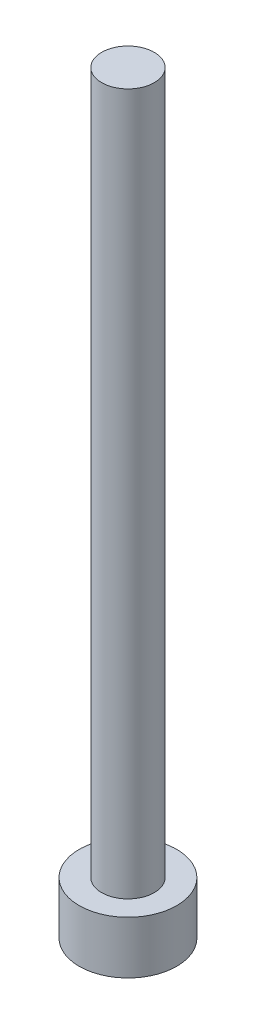
ISO-10303-21;
HEADER;
FILE_DESCRIPTION(('STEP AP214'),'2;1');
FILE_NAME('part.step','',(''),(''),'','','');
FILE_SCHEMA(('AUTOMOTIVE_DESIGN { 1 0 10303 214 1 1 1 1 }'));
ENDSEC;
DATA;
#1=APPLICATION_CONTEXT('core data for automotive mechanical design processes');
#2=APPLICATION_PROTOCOL_DEFINITION('international standard','automotive_design',2000,#1);
#3=PRODUCT_CONTEXT('',#1,'mechanical');
#4=PRODUCT('Part','Part','',(#3));
#5=PRODUCT_RELATED_PRODUCT_CATEGORY('part','',(#4));
#6=PRODUCT_DEFINITION_FORMATION('','',#4);
#7=PRODUCT_DEFINITION_CONTEXT('part definition',#1,'design');
#8=PRODUCT_DEFINITION('design','',#6,#7);
#9=PRODUCT_DEFINITION_SHAPE('','',#8);
#10=(LENGTH_UNIT() NAMED_UNIT(*) SI_UNIT(.MILLI.,.METRE.));
#11=(NAMED_UNIT(*) PLANE_ANGLE_UNIT() SI_UNIT($,.RADIAN.));
#12=(NAMED_UNIT(*) SI_UNIT($,.STERADIAN.) SOLID_ANGLE_UNIT());
#13=UNCERTAINTY_MEASURE_WITH_UNIT(LENGTH_MEASURE(1.E-05),#10,'distance_accuracy_value','');
#14=(GEOMETRIC_REPRESENTATION_CONTEXT(3) GLOBAL_UNCERTAINTY_ASSIGNED_CONTEXT((#13)) GLOBAL_UNIT_ASSIGNED_CONTEXT((#10,
#11,#12)) REPRESENTATION_CONTEXT('',''));
#15=CARTESIAN_POINT('',(0.,0.,0.));
#16=DIRECTION('',(0.,0.,1.));
#17=DIRECTION('',(1.,0.,0.));
#18=AXIS2_PLACEMENT_3D('',#15,#16,#17);
#19=CARTESIAN_POINT('',(0.,3.,0.));
#20=DIRECTION('',(0.,-1.,0.));
#21=DIRECTION('',(0.,0.,-1.));
#22=AXIS2_PLACEMENT_3D('',#19,#20,#21);
#23=CYLINDRICAL_SURFACE('',#22,2.78);
#24=CARTESIAN_POINT('',(0.,3.,0.));
#25=DIRECTION('',(0.,1.,0.));
#26=DIRECTION('',(0.,0.,1.));
#27=AXIS2_PLACEMENT_3D('',#24,#25,#26);
#28=CIRCLE('',#27,2.78);
#29=CARTESIAN_POINT('',(0.,3.,2.78));
#30=VERTEX_POINT('',#29);
#31=EDGE_CURVE('E10',#30,#30,#28,.T.);
#32=ORIENTED_EDGE('',*,*,#31,.F.);
#33=EDGE_LOOP('',(#32));
#34=FACE_BOUND('',#33,.T.);
#35=CARTESIAN_POINT('',(0.,0.,0.));
#36=DIRECTION('',(0.,1.,0.));
#37=DIRECTION('',(0.,0.,1.));
#38=AXIS2_PLACEMENT_3D('',#35,#36,#37);
#39=CIRCLE('',#38,2.78);
#40=CARTESIAN_POINT('',(0.,0.,2.78));
#41=VERTEX_POINT('',#40);
#42=EDGE_CURVE('E35',#41,#41,#39,.T.);
#43=ORIENTED_EDGE('',*,*,#42,.T.);
#44=EDGE_LOOP('',(#43));
#45=FACE_BOUND('',#44,.T.);
#46=ADVANCED_FACE('F32',(#34,#45),#23,.T.);
#47=CARTESIAN_POINT('',(0.,3.,0.));
#48=DIRECTION('',(0.,1.,0.));
#49=DIRECTION('',(0.,0.,1.));
#50=AXIS2_PLACEMENT_3D('',#47,#48,#49);
#51=PLANE('',#50);
#52=CARTESIAN_POINT('',(0.,3.,0.));
#53=DIRECTION('',(0.,1.,0.));
#54=DIRECTION('',(0.,0.,1.));
#55=AXIS2_PLACEMENT_3D('',#52,#53,#54);
#56=CIRCLE('',#55,1.5);
#57=CARTESIAN_POINT('',(0.,3.,1.5));
#58=VERTEX_POINT('',#57);
#59=EDGE_CURVE('E44',#58,#58,#56,.T.);
#60=ORIENTED_EDGE('',*,*,#59,.F.);
#61=EDGE_LOOP('',(#60));
#62=FACE_BOUND('',#61,.T.);
#63=ORIENTED_EDGE('',*,*,#31,.T.);
#64=EDGE_LOOP('',(#63));
#65=FACE_BOUND('',#64,.T.);
#66=ADVANCED_FACE('F59',(#62,#65),#51,.T.);
#67=CARTESIAN_POINT('',(0.,0.,0.));
#68=DIRECTION('',(0.,1.,0.));
#69=DIRECTION('',(0.,0.,1.));
#70=AXIS2_PLACEMENT_3D('',#67,#68,#69);
#71=PLANE('',#70);
#72=ORIENTED_EDGE('',*,*,#42,.F.);
#73=EDGE_LOOP('',(#72));
#74=FACE_BOUND('',#73,.T.);
#75=ADVANCED_FACE('F55',(#74),#71,.F.);
#76=CARTESIAN_POINT('',(0.,43.,0.));
#77=DIRECTION('',(0.,-1.,0.));
#78=DIRECTION('',(0.,0.,-1.));
#79=AXIS2_PLACEMENT_3D('',#76,#77,#78);
#80=CYLINDRICAL_SURFACE('',#79,1.5);
#81=CARTESIAN_POINT('',(0.,43.,0.));
#82=DIRECTION('',(0.,1.,0.));
#83=DIRECTION('',(0.,0.,1.));
#84=AXIS2_PLACEMENT_3D('',#81,#82,#83);
#85=CIRCLE('',#84,1.5);
#86=CARTESIAN_POINT('',(0.,43.,1.5));
#87=VERTEX_POINT('',#86);
#88=EDGE_CURVE('E42',#87,#87,#85,.T.);
#89=ORIENTED_EDGE('',*,*,#88,.F.);
#90=EDGE_LOOP('',(#89));
#91=FACE_BOUND('',#90,.T.);
#92=ORIENTED_EDGE('',*,*,#59,.T.);
#93=EDGE_LOOP('',(#92));
#94=FACE_BOUND('',#93,.T.);
#95=ADVANCED_FACE('F52',(#91,#94),#80,.T.);
#96=CARTESIAN_POINT('',(0.,43.,0.));
#97=DIRECTION('',(0.,1.,0.));
#98=DIRECTION('',(0.,0.,1.));
#99=AXIS2_PLACEMENT_3D('',#96,#97,#98);
#100=PLANE('',#99);
#101=ORIENTED_EDGE('',*,*,#88,.T.);
#102=EDGE_LOOP('',(#101));
#103=FACE_BOUND('',#102,.T.);
#104=ADVANCED_FACE('F50',(#103),#100,.T.);
#105=CLOSED_SHELL('',(#46,#66,#75,#95,#104));
#106=MANIFOLD_SOLID_BREP('B2',#105);
#107=ADVANCED_BREP_SHAPE_REPRESENTATION('',(#18,#106),#14);
#108=SHAPE_DEFINITION_REPRESENTATION(#9,#107);
ENDSEC;
END-ISO-10303-21;
